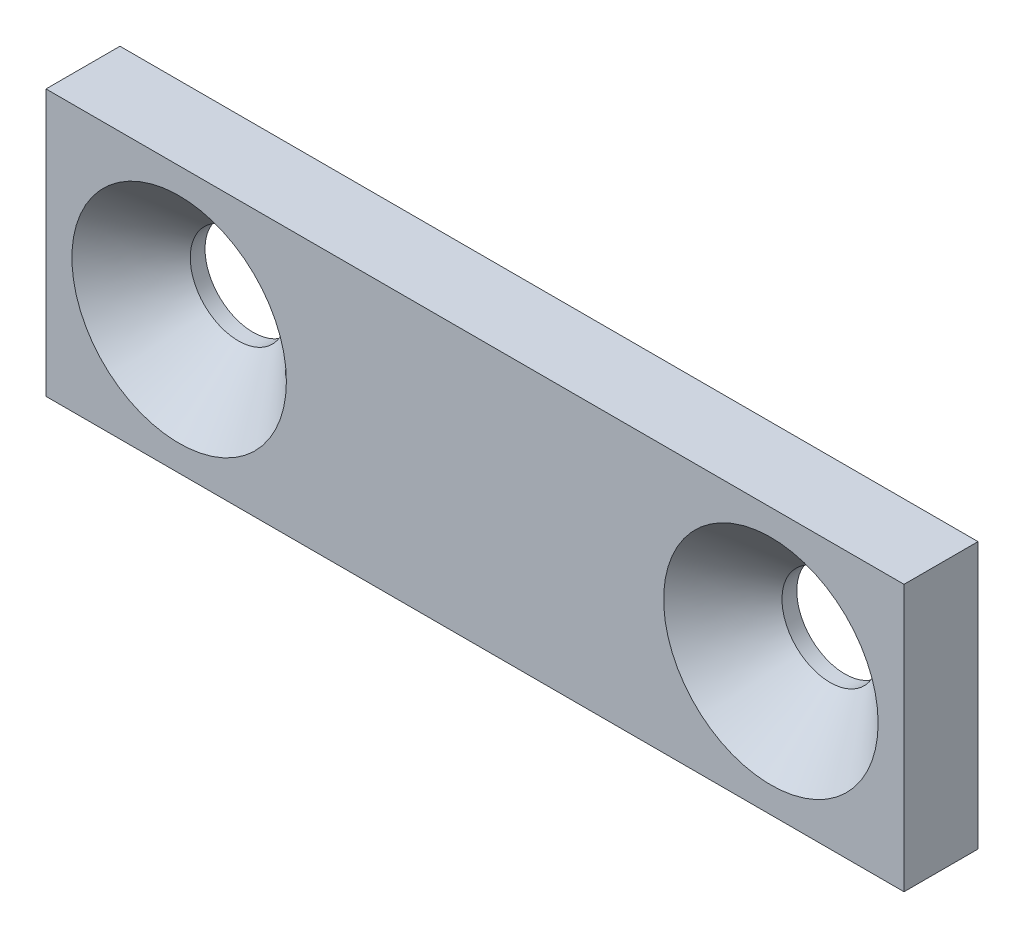
ISO-10303-21;
HEADER;
FILE_DESCRIPTION(('STEP AP214'),'2;1');
FILE_NAME('part.step','',(''),(''),'','','');
FILE_SCHEMA(('AUTOMOTIVE_DESIGN { 1 0 10303 214 1 1 1 1 }'));
ENDSEC;
DATA;
#1=APPLICATION_CONTEXT('core data for automotive mechanical design processes');
#2=APPLICATION_PROTOCOL_DEFINITION('international standard','automotive_design',2000,#1);
#3=PRODUCT_CONTEXT('',#1,'mechanical');
#4=PRODUCT('Part','Part','',(#3));
#5=PRODUCT_RELATED_PRODUCT_CATEGORY('part','',(#4));
#6=PRODUCT_DEFINITION_FORMATION('','',#4);
#7=PRODUCT_DEFINITION_CONTEXT('part definition',#1,'design');
#8=PRODUCT_DEFINITION('design','',#6,#7);
#9=PRODUCT_DEFINITION_SHAPE('','',#8);
#10=(LENGTH_UNIT() NAMED_UNIT(*) SI_UNIT(.MILLI.,.METRE.));
#11=(NAMED_UNIT(*) PLANE_ANGLE_UNIT() SI_UNIT($,.RADIAN.));
#12=(NAMED_UNIT(*) SI_UNIT($,.STERADIAN.) SOLID_ANGLE_UNIT());
#13=UNCERTAINTY_MEASURE_WITH_UNIT(LENGTH_MEASURE(1.E-05),#10,'distance_accuracy_value','');
#14=(GEOMETRIC_REPRESENTATION_CONTEXT(3) GLOBAL_UNCERTAINTY_ASSIGNED_CONTEXT((#13)) GLOBAL_UNIT_ASSIGNED_CONTEXT((#10,
#11,#12)) REPRESENTATION_CONTEXT('',''));
#15=CARTESIAN_POINT('',(0.,0.,0.));
#16=DIRECTION('',(0.,0.,1.));
#17=DIRECTION('',(1.,0.,0.));
#18=AXIS2_PLACEMENT_3D('',#15,#16,#17);
#19=CARTESIAN_POINT('',(29.,8.99999999999999,5.));
#20=DIRECTION('',(-1.,0.,0.));
#21=DIRECTION('',(0.,-1.,0.));
#22=AXIS2_PLACEMENT_3D('',#19,#20,#21);
#23=PLANE('',#22);
#24=DIRECTION('',(0.,1.,0.));
#25=VECTOR('',#24,1.);
#26=CARTESIAN_POINT('',(29.,8.99999999999999,0.));
#27=LINE('',#26,#25);
#28=CARTESIAN_POINT('',(29.,-9.,0.));
#29=VERTEX_POINT('',#28);
#30=CARTESIAN_POINT('',(29.,8.99999999999999,0.));
#31=VERTEX_POINT('',#30);
#32=EDGE_CURVE('E97',#29,#31,#27,.T.);
#33=ORIENTED_EDGE('',*,*,#32,.T.);
#34=DIRECTION('',(0.,0.,-1.));
#35=VECTOR('',#34,1.);
#36=CARTESIAN_POINT('',(29.,8.99999999999999,5.));
#37=LINE('',#36,#35);
#38=CARTESIAN_POINT('',(29.,8.99999999999999,5.));
#39=VERTEX_POINT('',#38);
#40=EDGE_CURVE('E11',#39,#31,#37,.T.);
#41=ORIENTED_EDGE('',*,*,#40,.F.);
#42=DIRECTION('',(0.,1.,0.));
#43=VECTOR('',#42,1.);
#44=CARTESIAN_POINT('',(29.,8.99999999999999,5.));
#45=LINE('',#44,#43);
#46=CARTESIAN_POINT('',(29.,-9.,5.));
#47=VERTEX_POINT('',#46);
#48=EDGE_CURVE('E85',#47,#39,#45,.T.);
#49=ORIENTED_EDGE('',*,*,#48,.F.);
#50=DIRECTION('',(0.,0.,-1.));
#51=VECTOR('',#50,1.);
#52=CARTESIAN_POINT('',(29.,-9.,5.));
#53=LINE('',#52,#51);
#54=EDGE_CURVE('E93',#47,#29,#53,.T.);
#55=ORIENTED_EDGE('',*,*,#54,.T.);
#56=EDGE_LOOP('',(#33,#41,#49,#55));
#57=FACE_BOUND('',#56,.T.);
#58=ADVANCED_FACE('F34',(#57),#23,.F.);
#59=CARTESIAN_POINT('',(-29.,9.,5.));
#60=DIRECTION('',(0.,-1.,0.));
#61=DIRECTION('',(1.,0.,0.));
#62=AXIS2_PLACEMENT_3D('',#59,#60,#61);
#63=PLANE('',#62);
#64=DIRECTION('',(-1.,0.,0.));
#65=VECTOR('',#64,1.);
#66=CARTESIAN_POINT('',(-29.,9.,0.));
#67=LINE('',#66,#65);
#68=CARTESIAN_POINT('',(-29.,9.,0.));
#69=VERTEX_POINT('',#68);
#70=EDGE_CURVE('E89',#31,#69,#67,.T.);
#71=ORIENTED_EDGE('',*,*,#70,.T.);
#72=DIRECTION('',(0.,0.,-1.));
#73=VECTOR('',#72,1.);
#74=CARTESIAN_POINT('',(-29.,9.,5.));
#75=LINE('',#74,#73);
#76=CARTESIAN_POINT('',(-29.,9.,5.));
#77=VERTEX_POINT('',#76);
#78=EDGE_CURVE('E42',#77,#69,#75,.T.);
#79=ORIENTED_EDGE('',*,*,#78,.F.);
#80=DIRECTION('',(-1.,0.,0.));
#81=VECTOR('',#80,1.);
#82=CARTESIAN_POINT('',(-29.,9.,5.));
#83=LINE('',#82,#81);
#84=EDGE_CURVE('E80',#39,#77,#83,.T.);
#85=ORIENTED_EDGE('',*,*,#84,.F.);
#86=ORIENTED_EDGE('',*,*,#40,.T.);
#87=EDGE_LOOP('',(#71,#79,#85,#86));
#88=FACE_BOUND('',#87,.T.);
#89=ADVANCED_FACE('F88',(#88),#63,.F.);
#90=CARTESIAN_POINT('',(-29.,9.,5.));
#91=DIRECTION('',(1.,0.,0.));
#92=DIRECTION('',(0.,0.,-1.));
#93=AXIS2_PLACEMENT_3D('',#90,#91,#92);
#94=PLANE('',#93);
#95=DIRECTION('',(0.,-1.,0.));
#96=VECTOR('',#95,1.);
#97=CARTESIAN_POINT('',(-29.,9.,0.));
#98=LINE('',#97,#96);
#99=CARTESIAN_POINT('',(-29.,-9.,0.));
#100=VERTEX_POINT('',#99);
#101=EDGE_CURVE('E67',#69,#100,#98,.T.);
#102=ORIENTED_EDGE('',*,*,#101,.T.);
#103=DIRECTION('',(0.,0.,-1.));
#104=VECTOR('',#103,1.);
#105=CARTESIAN_POINT('',(-29.,-9.,5.));
#106=LINE('',#105,#104);
#107=CARTESIAN_POINT('',(-29.,-9.,5.));
#108=VERTEX_POINT('',#107);
#109=EDGE_CURVE('E90',#108,#100,#106,.T.);
#110=ORIENTED_EDGE('',*,*,#109,.F.);
#111=DIRECTION('',(0.,-1.,0.));
#112=VECTOR('',#111,1.);
#113=CARTESIAN_POINT('',(-29.,9.,5.));
#114=LINE('',#113,#112);
#115=EDGE_CURVE('E83',#77,#108,#114,.T.);
#116=ORIENTED_EDGE('',*,*,#115,.F.);
#117=ORIENTED_EDGE('',*,*,#78,.T.);
#118=EDGE_LOOP('',(#102,#110,#116,#117));
#119=FACE_BOUND('',#118,.T.);
#120=ADVANCED_FACE('F91',(#119),#94,.F.);
#121=CARTESIAN_POINT('',(-29.,-9.,5.));
#122=DIRECTION('',(0.,1.,0.));
#123=DIRECTION('',(-1.,0.,0.));
#124=AXIS2_PLACEMENT_3D('',#121,#122,#123);
#125=PLANE('',#124);
#126=DIRECTION('',(1.,0.,0.));
#127=VECTOR('',#126,1.);
#128=CARTESIAN_POINT('',(-29.,-9.,0.));
#129=LINE('',#128,#127);
#130=EDGE_CURVE('E73',#100,#29,#129,.T.);
#131=ORIENTED_EDGE('',*,*,#130,.T.);
#132=ORIENTED_EDGE('',*,*,#54,.F.);
#133=DIRECTION('',(1.,0.,0.));
#134=VECTOR('',#133,1.);
#135=CARTESIAN_POINT('',(-29.,-9.,5.));
#136=LINE('',#135,#134);
#137=EDGE_CURVE('E50',#108,#47,#136,.T.);
#138=ORIENTED_EDGE('',*,*,#137,.F.);
#139=ORIENTED_EDGE('',*,*,#109,.T.);
#140=EDGE_LOOP('',(#131,#132,#138,#139));
#141=FACE_BOUND('',#140,.T.);
#142=ADVANCED_FACE('F105',(#141),#125,.F.);
#143=CARTESIAN_POINT('',(0.,0.,5.));
#144=DIRECTION('',(0.,0.,1.));
#145=DIRECTION('',(1.,0.,0.));
#146=AXIS2_PLACEMENT_3D('',#143,#144,#145);
#147=PLANE('',#146);
#148=CARTESIAN_POINT('',(-20.,0.,5.));
#149=DIRECTION('',(0.,0.,1.));
#150=DIRECTION('',(1.,0.,0.));
#151=AXIS2_PLACEMENT_3D('',#148,#149,#150);
#152=CIRCLE('',#151,7.25);
#153=CARTESIAN_POINT('',(-12.75,0.,5.));
#154=VERTEX_POINT('',#153);
#155=EDGE_CURVE('E125',#154,#154,#152,.T.);
#156=ORIENTED_EDGE('',*,*,#155,.F.);
#157=EDGE_LOOP('',(#156));
#158=FACE_BOUND('',#157,.T.);
#159=CARTESIAN_POINT('',(20.,0.,5.));
#160=DIRECTION('',(0.,0.,1.));
#161=DIRECTION('',(1.,0.,0.));
#162=AXIS2_PLACEMENT_3D('',#159,#160,#161);
#163=CIRCLE('',#162,7.25);
#164=CARTESIAN_POINT('',(27.25,0.,5.));
#165=VERTEX_POINT('',#164);
#166=EDGE_CURVE('E116',#165,#165,#163,.T.);
#167=ORIENTED_EDGE('',*,*,#166,.F.);
#168=EDGE_LOOP('',(#167));
#169=FACE_BOUND('',#168,.T.);
#170=ORIENTED_EDGE('',*,*,#48,.T.);
#171=ORIENTED_EDGE('',*,*,#84,.T.);
#172=ORIENTED_EDGE('',*,*,#115,.T.);
#173=ORIENTED_EDGE('',*,*,#137,.T.);
#174=EDGE_LOOP('',(#170,#171,#172,#173));
#175=FACE_BOUND('',#174,.T.);
#176=ADVANCED_FACE('F81',(#158,#169,#175),#147,.T.);
#177=CARTESIAN_POINT('',(0.,0.,0.));
#178=DIRECTION('',(0.,0.,1.));
#179=DIRECTION('',(1.,0.,0.));
#180=AXIS2_PLACEMENT_3D('',#177,#178,#179);
#181=PLANE('',#180);
#182=CARTESIAN_POINT('',(-20.,0.,0.));
#183=DIRECTION('',(0.,0.,1.));
#184=DIRECTION('',(1.,0.,0.));
#185=AXIS2_PLACEMENT_3D('',#182,#183,#184);
#186=CIRCLE('',#185,3.25);
#187=CARTESIAN_POINT('',(-16.75,0.,0.));
#188=VERTEX_POINT('',#187);
#189=EDGE_CURVE('E122',#188,#188,#186,.T.);
#190=ORIENTED_EDGE('',*,*,#189,.T.);
#191=EDGE_LOOP('',(#190));
#192=FACE_BOUND('',#191,.T.);
#193=CARTESIAN_POINT('',(20.,0.,0.));
#194=DIRECTION('',(0.,0.,1.));
#195=DIRECTION('',(1.,0.,0.));
#196=AXIS2_PLACEMENT_3D('',#193,#194,#195);
#197=CIRCLE('',#196,3.25);
#198=CARTESIAN_POINT('',(23.25,0.,0.));
#199=VERTEX_POINT('',#198);
#200=EDGE_CURVE('E100',#199,#199,#197,.T.);
#201=ORIENTED_EDGE('',*,*,#200,.T.);
#202=EDGE_LOOP('',(#201));
#203=FACE_BOUND('',#202,.T.);
#204=ORIENTED_EDGE('',*,*,#32,.F.);
#205=ORIENTED_EDGE('',*,*,#130,.F.);
#206=ORIENTED_EDGE('',*,*,#101,.F.);
#207=ORIENTED_EDGE('',*,*,#70,.F.);
#208=EDGE_LOOP('',(#204,#205,#206,#207));
#209=FACE_BOUND('',#208,.T.);
#210=ADVANCED_FACE('F108',(#192,#203,#209),#181,.F.);
#211=CARTESIAN_POINT('',(20.,0.,5.));
#212=DIRECTION('',(0.,0.,1.));
#213=DIRECTION('',(1.,0.,0.));
#214=AXIS2_PLACEMENT_3D('',#211,#212,#213);
#215=CYLINDRICAL_SURFACE('',#214,3.25);
#216=ORIENTED_EDGE('',*,*,#200,.F.);
#217=EDGE_LOOP('',(#216));
#218=FACE_BOUND('',#217,.T.);
#219=CARTESIAN_POINT('',(20.,0.,1.));
#220=DIRECTION('',(0.,0.,1.));
#221=DIRECTION('',(1.,0.,0.));
#222=AXIS2_PLACEMENT_3D('',#219,#220,#221);
#223=CIRCLE('',#222,3.25);
#224=CARTESIAN_POINT('',(23.25,0.,1.));
#225=VERTEX_POINT('',#224);
#226=EDGE_CURVE('E113',#225,#225,#223,.T.);
#227=ORIENTED_EDGE('',*,*,#226,.T.);
#228=EDGE_LOOP('',(#227));
#229=FACE_BOUND('',#228,.T.);
#230=ADVANCED_FACE('F139',(#218,#229),#215,.F.);
#231=CARTESIAN_POINT('',(20.,0.,5.));
#232=DIRECTION('',(0.,0.,1.));
#233=DIRECTION('',(1.,0.,0.));
#234=AXIS2_PLACEMENT_3D('',#231,#232,#233);
#235=CONICAL_SURFACE('',#234,7.25,0.785398163397448);
#236=ORIENTED_EDGE('',*,*,#226,.F.);
#237=EDGE_LOOP('',(#236));
#238=FACE_BOUND('',#237,.T.);
#239=ORIENTED_EDGE('',*,*,#166,.T.);
#240=EDGE_LOOP('',(#239));
#241=FACE_BOUND('',#240,.T.);
#242=ADVANCED_FACE('F136',(#238,#241),#235,.F.);
#243=CARTESIAN_POINT('',(-20.,0.,5.));
#244=DIRECTION('',(0.,0.,1.));
#245=DIRECTION('',(1.,0.,0.));
#246=AXIS2_PLACEMENT_3D('',#243,#244,#245);
#247=CYLINDRICAL_SURFACE('',#246,3.25);
#248=ORIENTED_EDGE('',*,*,#189,.F.);
#249=EDGE_LOOP('',(#248));
#250=FACE_BOUND('',#249,.T.);
#251=CARTESIAN_POINT('',(-20.,0.,1.));
#252=DIRECTION('',(0.,0.,1.));
#253=DIRECTION('',(1.,0.,0.));
#254=AXIS2_PLACEMENT_3D('',#251,#252,#253);
#255=CIRCLE('',#254,3.25);
#256=CARTESIAN_POINT('',(-16.75,0.,1.));
#257=VERTEX_POINT('',#256);
#258=EDGE_CURVE('E119',#257,#257,#255,.T.);
#259=ORIENTED_EDGE('',*,*,#258,.T.);
#260=EDGE_LOOP('',(#259));
#261=FACE_BOUND('',#260,.T.);
#262=ADVANCED_FACE('F138',(#250,#261),#247,.F.);
#263=CARTESIAN_POINT('',(-20.,0.,5.));
#264=DIRECTION('',(0.,0.,1.));
#265=DIRECTION('',(1.,0.,0.));
#266=AXIS2_PLACEMENT_3D('',#263,#264,#265);
#267=CONICAL_SURFACE('',#266,7.25,0.785398163397448);
#268=ORIENTED_EDGE('',*,*,#258,.F.);
#269=EDGE_LOOP('',(#268));
#270=FACE_BOUND('',#269,.T.);
#271=ORIENTED_EDGE('',*,*,#155,.T.);
#272=EDGE_LOOP('',(#271));
#273=FACE_BOUND('',#272,.T.);
#274=ADVANCED_FACE('F129',(#270,#273),#267,.F.);
#275=CLOSED_SHELL('',(#58,#89,#120,#142,#176,#210,#230,#242,#262,#274));
#276=MANIFOLD_SOLID_BREP('B2',#275);
#277=ADVANCED_BREP_SHAPE_REPRESENTATION('',(#18,#276),#14);
#278=SHAPE_DEFINITION_REPRESENTATION(#9,#277);
ENDSEC;
END-ISO-10303-21;
